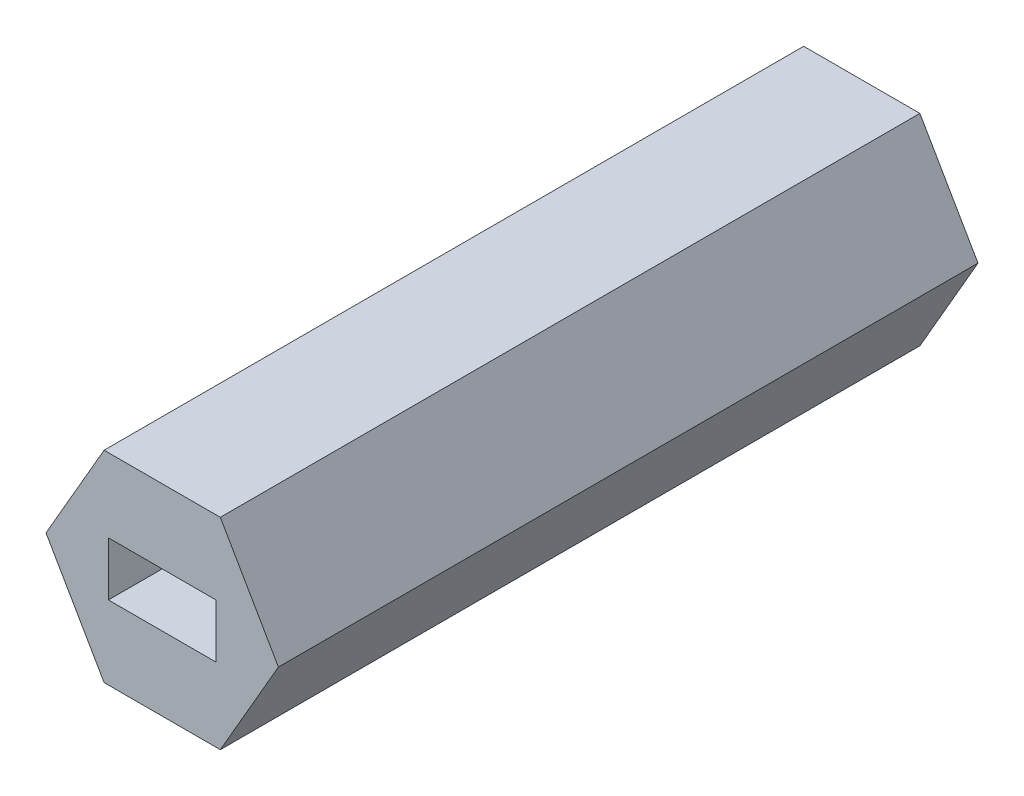
ISO-10303-21;
HEADER;
FILE_DESCRIPTION(('STEP AP214'),'2;1');
FILE_NAME('part.step','',(''),(''),'','','');
FILE_SCHEMA(('AUTOMOTIVE_DESIGN { 1 0 10303 214 1 1 1 1 }'));
ENDSEC;
DATA;
#1=APPLICATION_CONTEXT('core data for automotive mechanical design processes');
#2=APPLICATION_PROTOCOL_DEFINITION('international standard','automotive_design',2000,#1);
#3=PRODUCT_CONTEXT('',#1,'mechanical');
#4=PRODUCT('Part','Part','',(#3));
#5=PRODUCT_RELATED_PRODUCT_CATEGORY('part','',(#4));
#6=PRODUCT_DEFINITION_FORMATION('','',#4);
#7=PRODUCT_DEFINITION_CONTEXT('part definition',#1,'design');
#8=PRODUCT_DEFINITION('design','',#6,#7);
#9=PRODUCT_DEFINITION_SHAPE('','',#8);
#10=(LENGTH_UNIT() NAMED_UNIT(*) SI_UNIT(.MILLI.,.METRE.));
#11=(NAMED_UNIT(*) PLANE_ANGLE_UNIT() SI_UNIT($,.RADIAN.));
#12=(NAMED_UNIT(*) SI_UNIT($,.STERADIAN.) SOLID_ANGLE_UNIT());
#13=UNCERTAINTY_MEASURE_WITH_UNIT(LENGTH_MEASURE(1.E-05),#10,'distance_accuracy_value','');
#14=(GEOMETRIC_REPRESENTATION_CONTEXT(3) GLOBAL_UNCERTAINTY_ASSIGNED_CONTEXT((#13)) GLOBAL_UNIT_ASSIGNED_CONTEXT((#10,
#11,#12)) REPRESENTATION_CONTEXT('',''));
#15=CARTESIAN_POINT('',(0.,0.,0.));
#16=DIRECTION('',(0.,0.,1.));
#17=DIRECTION('',(1.,0.,0.));
#18=AXIS2_PLACEMENT_3D('',#15,#16,#17);
#19=CARTESIAN_POINT('',(0.,0.,33.02));
#20=DIRECTION('',(0.,0.,1.));
#21=DIRECTION('',(1.,0.,0.));
#22=AXIS2_PLACEMENT_3D('',#19,#20,#21);
#23=PLANE('',#22);
#24=DIRECTION('',(-1.,0.,0.));
#25=VECTOR('',#24,1.);
#26=CARTESIAN_POINT('',(2.74241377865072,4.75,33.02));
#27=LINE('',#26,#25);
#28=CARTESIAN_POINT('',(2.74241377865072,4.75,33.02));
#29=VERTEX_POINT('',#28);
#30=CARTESIAN_POINT('',(-2.74241377865072,4.75,33.02));
#31=VERTEX_POINT('',#30);
#32=EDGE_CURVE('E165',#29,#31,#27,.T.);
#33=ORIENTED_EDGE('',*,*,#32,.T.);
#34=DIRECTION('',(-0.5,-0.866025403784438,0.));
#35=VECTOR('',#34,1.);
#36=CARTESIAN_POINT('',(-2.74241377865072,4.75,33.02));
#37=LINE('',#36,#35);
#38=CARTESIAN_POINT('',(-5.48482755730145,0.,33.02));
#39=VERTEX_POINT('',#38);
#40=EDGE_CURVE('E169',#31,#39,#37,.T.);
#41=ORIENTED_EDGE('',*,*,#40,.T.);
#42=DIRECTION('',(0.5,-0.866025403784439,0.));
#43=VECTOR('',#42,1.);
#44=CARTESIAN_POINT('',(-5.48482755730145,0.,33.02));
#45=LINE('',#44,#43);
#46=CARTESIAN_POINT('',(-2.74241377865073,-4.75,33.02));
#47=VERTEX_POINT('',#46);
#48=EDGE_CURVE('E173',#39,#47,#45,.T.);
#49=ORIENTED_EDGE('',*,*,#48,.T.);
#50=DIRECTION('',(1.,0.,0.));
#51=VECTOR('',#50,1.);
#52=CARTESIAN_POINT('',(-2.74241377865073,-4.75,33.02));
#53=LINE('',#52,#51);
#54=CARTESIAN_POINT('',(2.74241377865072,-4.75,33.02));
#55=VERTEX_POINT('',#54);
#56=EDGE_CURVE('E176',#47,#55,#53,.T.);
#57=ORIENTED_EDGE('',*,*,#56,.T.);
#58=DIRECTION('',(0.5,0.866025403784439,0.));
#59=VECTOR('',#58,1.);
#60=CARTESIAN_POINT('',(2.74241377865072,-4.75,33.02));
#61=LINE('',#60,#59);
#62=CARTESIAN_POINT('',(5.48482755730145,0.,33.02));
#63=VERTEX_POINT('',#62);
#64=EDGE_CURVE('E179',#55,#63,#61,.T.);
#65=ORIENTED_EDGE('',*,*,#64,.T.);
#66=DIRECTION('',(-0.5,0.866025403784439,0.));
#67=VECTOR('',#66,1.);
#68=CARTESIAN_POINT('',(5.48482755730145,0.,33.02));
#69=LINE('',#68,#67);
#70=EDGE_CURVE('E182',#63,#29,#69,.T.);
#71=ORIENTED_EDGE('',*,*,#70,.T.);
#72=EDGE_LOOP('',(#33,#41,#49,#57,#65,#71));
#73=FACE_BOUND('',#72,.T.);
#74=DIRECTION('',(1.,0.,0.));
#75=VECTOR('',#74,1.);
#76=CARTESIAN_POINT('',(2.54,-1.27,33.02));
#77=LINE('',#76,#75);
#78=CARTESIAN_POINT('',(-2.54,-1.27,33.02));
#79=VERTEX_POINT('',#78);
#80=CARTESIAN_POINT('',(2.54,-1.27,33.02));
#81=VERTEX_POINT('',#80);
#82=EDGE_CURVE('E126',#79,#81,#77,.T.);
#83=ORIENTED_EDGE('',*,*,#82,.F.);
#84=DIRECTION('',(0.,-1.,0.));
#85=VECTOR('',#84,1.);
#86=CARTESIAN_POINT('',(-2.54,-1.27,33.02));
#87=LINE('',#86,#85);
#88=CARTESIAN_POINT('',(-2.54,1.27,33.02));
#89=VERTEX_POINT('',#88);
#90=EDGE_CURVE('E117',#89,#79,#87,.T.);
#91=ORIENTED_EDGE('',*,*,#90,.F.);
#92=DIRECTION('',(-1.,0.,0.));
#93=VECTOR('',#92,1.);
#94=CARTESIAN_POINT('',(2.54,1.27,33.02));
#95=LINE('',#94,#93);
#96=CARTESIAN_POINT('',(2.54,1.27,33.02));
#97=VERTEX_POINT('',#96);
#98=EDGE_CURVE('E143',#97,#89,#95,.T.);
#99=ORIENTED_EDGE('',*,*,#98,.F.);
#100=DIRECTION('',(0.,1.,0.));
#101=VECTOR('',#100,1.);
#102=CARTESIAN_POINT('',(2.54,-1.27,33.02));
#103=LINE('',#102,#101);
#104=EDGE_CURVE('E139',#81,#97,#103,.T.);
#105=ORIENTED_EDGE('',*,*,#104,.F.);
#106=EDGE_LOOP('',(#83,#91,#99,#105));
#107=FACE_BOUND('',#106,.T.);
#108=ADVANCED_FACE('F39',(#73,#107),#23,.T.);
#109=CARTESIAN_POINT('',(0.,0.,0.));
#110=DIRECTION('',(0.,0.,1.));
#111=DIRECTION('',(1.,0.,0.));
#112=AXIS2_PLACEMENT_3D('',#109,#110,#111);
#113=PLANE('',#112);
#114=DIRECTION('',(-1.,0.,0.));
#115=VECTOR('',#114,1.);
#116=CARTESIAN_POINT('',(2.74241377865072,4.75,0.));
#117=LINE('',#116,#115);
#118=CARTESIAN_POINT('',(2.74241377865072,4.75,0.));
#119=VERTEX_POINT('',#118);
#120=CARTESIAN_POINT('',(-2.74241377865072,4.75,0.));
#121=VERTEX_POINT('',#120);
#122=EDGE_CURVE('E135',#119,#121,#117,.T.);
#123=ORIENTED_EDGE('',*,*,#122,.F.);
#124=DIRECTION('',(-0.5,0.866025403784439,0.));
#125=VECTOR('',#124,1.);
#126=CARTESIAN_POINT('',(5.48482755730145,0.,0.));
#127=LINE('',#126,#125);
#128=CARTESIAN_POINT('',(5.48482755730145,0.,0.));
#129=VERTEX_POINT('',#128);
#130=EDGE_CURVE('E170',#129,#119,#127,.T.);
#131=ORIENTED_EDGE('',*,*,#130,.F.);
#132=DIRECTION('',(0.5,0.866025403784439,0.));
#133=VECTOR('',#132,1.);
#134=CARTESIAN_POINT('',(2.74241377865072,-4.75,0.));
#135=LINE('',#134,#133);
#136=CARTESIAN_POINT('',(2.74241377865072,-4.75,0.));
#137=VERTEX_POINT('',#136);
#138=EDGE_CURVE('E198',#137,#129,#135,.T.);
#139=ORIENTED_EDGE('',*,*,#138,.F.);
#140=DIRECTION('',(1.,0.,0.));
#141=VECTOR('',#140,1.);
#142=CARTESIAN_POINT('',(-2.74241377865073,-4.75,0.));
#143=LINE('',#142,#141);
#144=CARTESIAN_POINT('',(-2.74241377865073,-4.75,0.));
#145=VERTEX_POINT('',#144);
#146=EDGE_CURVE('E195',#145,#137,#143,.T.);
#147=ORIENTED_EDGE('',*,*,#146,.F.);
#148=DIRECTION('',(0.5,-0.866025403784439,0.));
#149=VECTOR('',#148,1.);
#150=CARTESIAN_POINT('',(-5.48482755730145,0.,0.));
#151=LINE('',#150,#149);
#152=CARTESIAN_POINT('',(-5.48482755730145,0.,0.));
#153=VERTEX_POINT('',#152);
#154=EDGE_CURVE('E192',#153,#145,#151,.T.);
#155=ORIENTED_EDGE('',*,*,#154,.F.);
#156=DIRECTION('',(-0.5,-0.866025403784438,0.));
#157=VECTOR('',#156,1.);
#158=CARTESIAN_POINT('',(-2.74241377865072,4.75,0.));
#159=LINE('',#158,#157);
#160=EDGE_CURVE('E189',#121,#153,#159,.T.);
#161=ORIENTED_EDGE('',*,*,#160,.F.);
#162=EDGE_LOOP('',(#123,#131,#139,#147,#155,#161));
#163=FACE_BOUND('',#162,.T.);
#164=DIRECTION('',(0.,-1.,0.));
#165=VECTOR('',#164,1.);
#166=CARTESIAN_POINT('',(-2.54,-1.27,0.));
#167=LINE('',#166,#165);
#168=CARTESIAN_POINT('',(-2.54,1.27,0.));
#169=VERTEX_POINT('',#168);
#170=CARTESIAN_POINT('',(-2.54,-1.27,0.));
#171=VERTEX_POINT('',#170);
#172=EDGE_CURVE('E63',#169,#171,#167,.T.);
#173=ORIENTED_EDGE('',*,*,#172,.T.);
#174=DIRECTION('',(1.,0.,0.));
#175=VECTOR('',#174,1.);
#176=CARTESIAN_POINT('',(2.54,-1.27,0.));
#177=LINE('',#176,#175);
#178=CARTESIAN_POINT('',(2.54,-1.27,0.));
#179=VERTEX_POINT('',#178);
#180=EDGE_CURVE('E133',#171,#179,#177,.T.);
#181=ORIENTED_EDGE('',*,*,#180,.T.);
#182=DIRECTION('',(0.,1.,0.));
#183=VECTOR('',#182,1.);
#184=CARTESIAN_POINT('',(2.54,-1.27,0.));
#185=LINE('',#184,#183);
#186=CARTESIAN_POINT('',(2.54,1.27,0.));
#187=VERTEX_POINT('',#186);
#188=EDGE_CURVE('E152',#179,#187,#185,.T.);
#189=ORIENTED_EDGE('',*,*,#188,.T.);
#190=DIRECTION('',(-1.,0.,0.));
#191=VECTOR('',#190,1.);
#192=CARTESIAN_POINT('',(2.54,1.27,0.));
#193=LINE('',#192,#191);
#194=EDGE_CURVE('E127',#187,#169,#193,.T.);
#195=ORIENTED_EDGE('',*,*,#194,.T.);
#196=EDGE_LOOP('',(#173,#181,#189,#195));
#197=FACE_BOUND('',#196,.T.);
#198=ADVANCED_FACE('F229',(#163,#197),#113,.F.);
#199=CARTESIAN_POINT('',(2.74241377865072,4.75,33.02));
#200=DIRECTION('',(0.,-1.,0.));
#201=DIRECTION('',(0.,0.,-1.));
#202=AXIS2_PLACEMENT_3D('',#199,#200,#201);
#203=PLANE('',#202);
#204=ORIENTED_EDGE('',*,*,#122,.T.);
#205=DIRECTION('',(0.,0.,-1.));
#206=VECTOR('',#205,1.);
#207=CARTESIAN_POINT('',(-2.74241377865072,4.75,33.02));
#208=LINE('',#207,#206);
#209=EDGE_CURVE('E11',#31,#121,#208,.T.);
#210=ORIENTED_EDGE('',*,*,#209,.F.);
#211=ORIENTED_EDGE('',*,*,#32,.F.);
#212=DIRECTION('',(0.,0.,-1.));
#213=VECTOR('',#212,1.);
#214=CARTESIAN_POINT('',(2.74241377865072,4.75,33.02));
#215=LINE('',#214,#213);
#216=EDGE_CURVE('E185',#29,#119,#215,.T.);
#217=ORIENTED_EDGE('',*,*,#216,.T.);
#218=EDGE_LOOP('',(#204,#210,#211,#217));
#219=FACE_BOUND('',#218,.T.);
#220=ADVANCED_FACE('F41',(#219),#203,.F.);
#221=CARTESIAN_POINT('',(-2.74241377865072,4.75,33.02));
#222=DIRECTION('',(0.866025403784438,-0.5,0.));
#223=DIRECTION('',(0.5,0.866025403784438,0.));
#224=AXIS2_PLACEMENT_3D('',#221,#222,#223);
#225=PLANE('',#224);
#226=ORIENTED_EDGE('',*,*,#160,.T.);
#227=DIRECTION('',(0.,0.,-1.));
#228=VECTOR('',#227,1.);
#229=CARTESIAN_POINT('',(-5.48482755730145,0.,33.02));
#230=LINE('',#229,#228);
#231=EDGE_CURVE('E48',#39,#153,#230,.T.);
#232=ORIENTED_EDGE('',*,*,#231,.F.);
#233=ORIENTED_EDGE('',*,*,#40,.F.);
#234=ORIENTED_EDGE('',*,*,#209,.T.);
#235=EDGE_LOOP('',(#226,#232,#233,#234));
#236=FACE_BOUND('',#235,.T.);
#237=ADVANCED_FACE('F246',(#236),#225,.F.);
#238=CARTESIAN_POINT('',(-5.48482755730145,0.,33.02));
#239=DIRECTION('',(0.866025403784439,0.5,0.));
#240=DIRECTION('',(-0.5,0.866025403784439,0.));
#241=AXIS2_PLACEMENT_3D('',#238,#239,#240);
#242=PLANE('',#241);
#243=ORIENTED_EDGE('',*,*,#154,.T.);
#244=DIRECTION('',(0.,0.,-1.));
#245=VECTOR('',#244,1.);
#246=CARTESIAN_POINT('',(-2.74241377865073,-4.75,33.02));
#247=LINE('',#246,#245);
#248=EDGE_CURVE('E214',#47,#145,#247,.T.);
#249=ORIENTED_EDGE('',*,*,#248,.F.);
#250=ORIENTED_EDGE('',*,*,#48,.F.);
#251=ORIENTED_EDGE('',*,*,#231,.T.);
#252=EDGE_LOOP('',(#243,#249,#250,#251));
#253=FACE_BOUND('',#252,.T.);
#254=ADVANCED_FACE('F223',(#253),#242,.F.);
#255=CARTESIAN_POINT('',(-2.74241377865073,-4.75,33.02));
#256=DIRECTION('',(0.,1.,0.));
#257=DIRECTION('',(0.,0.,1.));
#258=AXIS2_PLACEMENT_3D('',#255,#256,#257);
#259=PLANE('',#258);
#260=ORIENTED_EDGE('',*,*,#146,.T.);
#261=DIRECTION('',(0.,0.,-1.));
#262=VECTOR('',#261,1.);
#263=CARTESIAN_POINT('',(2.74241377865072,-4.75,33.02));
#264=LINE('',#263,#262);
#265=EDGE_CURVE('E210',#55,#137,#264,.T.);
#266=ORIENTED_EDGE('',*,*,#265,.F.);
#267=ORIENTED_EDGE('',*,*,#56,.F.);
#268=ORIENTED_EDGE('',*,*,#248,.T.);
#269=EDGE_LOOP('',(#260,#266,#267,#268));
#270=FACE_BOUND('',#269,.T.);
#271=ADVANCED_FACE('F235',(#270),#259,.F.);
#272=CARTESIAN_POINT('',(2.74241377865072,-4.75,33.02));
#273=DIRECTION('',(-0.866025403784439,0.5,0.));
#274=DIRECTION('',(-0.5,-0.866025403784439,0.));
#275=AXIS2_PLACEMENT_3D('',#272,#273,#274);
#276=PLANE('',#275);
#277=ORIENTED_EDGE('',*,*,#138,.T.);
#278=DIRECTION('',(0.,0.,-1.));
#279=VECTOR('',#278,1.);
#280=CARTESIAN_POINT('',(5.48482755730145,0.,33.02));
#281=LINE('',#280,#279);
#282=EDGE_CURVE('E206',#63,#129,#281,.T.);
#283=ORIENTED_EDGE('',*,*,#282,.F.);
#284=ORIENTED_EDGE('',*,*,#64,.F.);
#285=ORIENTED_EDGE('',*,*,#265,.T.);
#286=EDGE_LOOP('',(#277,#283,#284,#285));
#287=FACE_BOUND('',#286,.T.);
#288=ADVANCED_FACE('F239',(#287),#276,.F.);
#289=CARTESIAN_POINT('',(5.48482755730145,0.,33.02));
#290=DIRECTION('',(-0.866025403784439,-0.5,0.));
#291=DIRECTION('',(0.5,-0.866025403784439,0.));
#292=AXIS2_PLACEMENT_3D('',#289,#290,#291);
#293=PLANE('',#292);
#294=ORIENTED_EDGE('',*,*,#130,.T.);
#295=ORIENTED_EDGE('',*,*,#216,.F.);
#296=ORIENTED_EDGE('',*,*,#70,.F.);
#297=ORIENTED_EDGE('',*,*,#282,.T.);
#298=EDGE_LOOP('',(#294,#295,#296,#297));
#299=FACE_BOUND('',#298,.T.);
#300=ADVANCED_FACE('F249',(#299),#293,.F.);
#301=CARTESIAN_POINT('',(-2.54,-1.27,33.02));
#302=DIRECTION('',(1.,0.,0.));
#303=DIRECTION('',(0.,0.,-1.));
#304=AXIS2_PLACEMENT_3D('',#301,#302,#303);
#305=PLANE('',#304);
#306=ORIENTED_EDGE('',*,*,#172,.F.);
#307=DIRECTION('',(0.,0.,-1.));
#308=VECTOR('',#307,1.);
#309=CARTESIAN_POINT('',(-2.54,1.27,33.02));
#310=LINE('',#309,#308);
#311=EDGE_CURVE('E121',#89,#169,#310,.T.);
#312=ORIENTED_EDGE('',*,*,#311,.F.);
#313=ORIENTED_EDGE('',*,*,#90,.T.);
#314=DIRECTION('',(0.,0.,-1.));
#315=VECTOR('',#314,1.);
#316=CARTESIAN_POINT('',(-2.54,-1.27,33.02));
#317=LINE('',#316,#315);
#318=EDGE_CURVE('E120',#79,#171,#317,.T.);
#319=ORIENTED_EDGE('',*,*,#318,.T.);
#320=EDGE_LOOP('',(#306,#312,#313,#319));
#321=FACE_BOUND('',#320,.T.);
#322=ADVANCED_FACE('F119',(#321),#305,.T.);
#323=CARTESIAN_POINT('',(2.54,-1.27,33.02));
#324=DIRECTION('',(0.,1.,0.));
#325=DIRECTION('',(-1.,0.,0.));
#326=AXIS2_PLACEMENT_3D('',#323,#324,#325);
#327=PLANE('',#326);
#328=ORIENTED_EDGE('',*,*,#180,.F.);
#329=ORIENTED_EDGE('',*,*,#318,.F.);
#330=ORIENTED_EDGE('',*,*,#82,.T.);
#331=DIRECTION('',(0.,0.,-1.));
#332=VECTOR('',#331,1.);
#333=CARTESIAN_POINT('',(2.54,-1.27,33.02));
#334=LINE('',#333,#332);
#335=EDGE_CURVE('E136',#81,#179,#334,.T.);
#336=ORIENTED_EDGE('',*,*,#335,.T.);
#337=EDGE_LOOP('',(#328,#329,#330,#336));
#338=FACE_BOUND('',#337,.T.);
#339=ADVANCED_FACE('F130',(#338),#327,.T.);
#340=CARTESIAN_POINT('',(2.54,-1.27,33.02));
#341=DIRECTION('',(-1.,0.,0.));
#342=DIRECTION('',(0.,0.,1.));
#343=AXIS2_PLACEMENT_3D('',#340,#341,#342);
#344=PLANE('',#343);
#345=ORIENTED_EDGE('',*,*,#188,.F.);
#346=ORIENTED_EDGE('',*,*,#335,.F.);
#347=ORIENTED_EDGE('',*,*,#104,.T.);
#348=DIRECTION('',(0.,0.,-1.));
#349=VECTOR('',#348,1.);
#350=CARTESIAN_POINT('',(2.54,1.27,33.02));
#351=LINE('',#350,#349);
#352=EDGE_CURVE('E55',#97,#187,#351,.T.);
#353=ORIENTED_EDGE('',*,*,#352,.T.);
#354=EDGE_LOOP('',(#345,#346,#347,#353));
#355=FACE_BOUND('',#354,.T.);
#356=ADVANCED_FACE('F267',(#355),#344,.T.);
#357=CARTESIAN_POINT('',(2.54,1.27,33.02));
#358=DIRECTION('',(0.,-1.,0.));
#359=DIRECTION('',(1.,0.,0.));
#360=AXIS2_PLACEMENT_3D('',#357,#358,#359);
#361=PLANE('',#360);
#362=ORIENTED_EDGE('',*,*,#194,.F.);
#363=ORIENTED_EDGE('',*,*,#352,.F.);
#364=ORIENTED_EDGE('',*,*,#98,.T.);
#365=ORIENTED_EDGE('',*,*,#311,.T.);
#366=EDGE_LOOP('',(#362,#363,#364,#365));
#367=FACE_BOUND('',#366,.T.);
#368=ADVANCED_FACE('F270',(#367),#361,.T.);
#369=CLOSED_SHELL('',(#108,#198,#220,#237,#254,#271,#288,#300,#322,#339,#356,#368));
#370=MANIFOLD_SOLID_BREP('B2',#369);
#371=ADVANCED_BREP_SHAPE_REPRESENTATION('',(#18,#370),#14);
#372=SHAPE_DEFINITION_REPRESENTATION(#9,#371);
ENDSEC;
END-ISO-10303-21;
